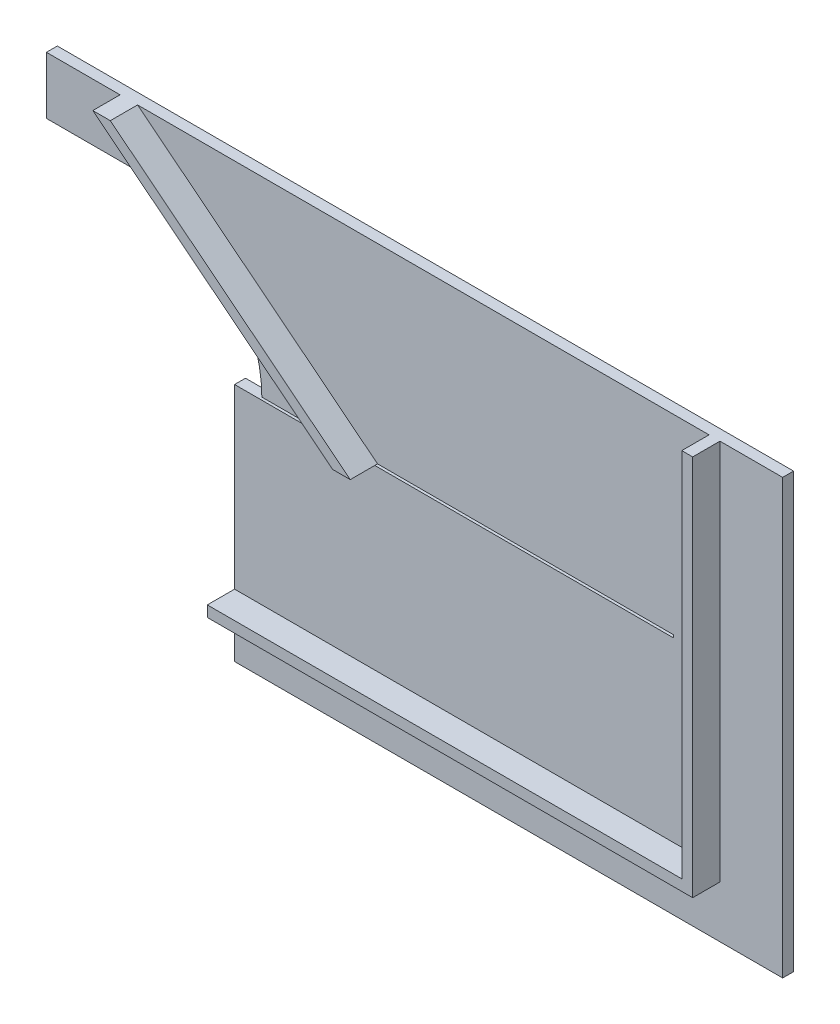
ISO-10303-21;
HEADER;
FILE_DESCRIPTION(('STEP AP214'),'2;1');
FILE_NAME('part.step','',(''),(''),'','','');
FILE_SCHEMA(('AUTOMOTIVE_DESIGN { 1 0 10303 214 1 1 1 1 }'));
ENDSEC;
DATA;
#1=APPLICATION_CONTEXT('core data for automotive mechanical design processes');
#2=APPLICATION_PROTOCOL_DEFINITION('international standard','automotive_design',2000,#1);
#3=PRODUCT_CONTEXT('',#1,'mechanical');
#4=PRODUCT('Part','Part','',(#3));
#5=PRODUCT_RELATED_PRODUCT_CATEGORY('part','',(#4));
#6=PRODUCT_DEFINITION_FORMATION('','',#4);
#7=PRODUCT_DEFINITION_CONTEXT('part definition',#1,'design');
#8=PRODUCT_DEFINITION('design','',#6,#7);
#9=PRODUCT_DEFINITION_SHAPE('','',#8);
#10=(LENGTH_UNIT() NAMED_UNIT(*) SI_UNIT(.MILLI.,.METRE.));
#11=(NAMED_UNIT(*) PLANE_ANGLE_UNIT() SI_UNIT($,.RADIAN.));
#12=(NAMED_UNIT(*) SI_UNIT($,.STERADIAN.) SOLID_ANGLE_UNIT());
#13=UNCERTAINTY_MEASURE_WITH_UNIT(LENGTH_MEASURE(1.E-05),#10,'distance_accuracy_value','');
#14=(GEOMETRIC_REPRESENTATION_CONTEXT(3) GLOBAL_UNCERTAINTY_ASSIGNED_CONTEXT((#13)) GLOBAL_UNIT_ASSIGNED_CONTEXT((#10,
#11,#12)) REPRESENTATION_CONTEXT('',''));
#15=CARTESIAN_POINT('',(0.,0.,0.));
#16=DIRECTION('',(0.,0.,1.));
#17=DIRECTION('',(1.,0.,0.));
#18=AXIS2_PLACEMENT_3D('',#15,#16,#17);
#19=CARTESIAN_POINT('',(0.,0.,0.));
#20=DIRECTION('',(0.,0.,1.));
#21=DIRECTION('',(1.,0.,0.));
#22=AXIS2_PLACEMENT_3D('',#19,#20,#21);
#23=PLANE('',#22);
#24=DIRECTION('',(1.,0.,0.));
#25=VECTOR('',#24,1.);
#26=CARTESIAN_POINT('',(0.,0.,0.));
#27=LINE('',#26,#25);
#28=CARTESIAN_POINT('',(33.4254595642836,0.,0.));
#29=VERTEX_POINT('',#28);
#30=CARTESIAN_POINT('',(243.,0.,0.));
#31=VERTEX_POINT('',#30);
#32=EDGE_CURVE('E291',#29,#31,#27,.T.);
#33=ORIENTED_EDGE('',*,*,#32,.F.);
#34=DIRECTION('',(-0.782601054175648,0.622523565821539,0.));
#35=VECTOR('',#34,1.);
#36=CARTESIAN_POINT('',(117.490094263286,-66.8695957832974,0.));
#37=LINE('',#36,#35);
#38=CARTESIAN_POINT('',(121.425459564284,-70.,0.));
#39=VERTEX_POINT('',#38);
#40=EDGE_CURVE('E336',#39,#29,#37,.T.);
#41=ORIENTED_EDGE('',*,*,#40,.F.);
#42=DIRECTION('',(-1.,0.,0.));
#43=VECTOR('',#42,1.);
#44=CARTESIAN_POINT('',(0.,-70.,0.));
#45=LINE('',#44,#43);
#46=CARTESIAN_POINT('',(230.,-70.,0.));
#47=VERTEX_POINT('',#46);
#48=EDGE_CURVE('E198',#47,#39,#45,.T.);
#49=ORIENTED_EDGE('',*,*,#48,.F.);
#50=DIRECTION('',(0.,1.,0.));
#51=VECTOR('',#50,1.);
#52=CARTESIAN_POINT('',(230.,0.,0.));
#53=LINE('',#52,#51);
#54=CARTESIAN_POINT('',(230.,-71.,0.));
#55=VERTEX_POINT('',#54);
#56=EDGE_CURVE('E275',#55,#47,#53,.T.);
#57=ORIENTED_EDGE('',*,*,#56,.F.);
#58=DIRECTION('',(1.,0.,0.));
#59=VECTOR('',#58,1.);
#60=CARTESIAN_POINT('',(0.,-71.,0.));
#61=LINE('',#60,#59);
#62=CARTESIAN_POINT('',(69.,-71.,0.));
#63=VERTEX_POINT('',#62);
#64=EDGE_CURVE('E277',#63,#55,#61,.T.);
#65=ORIENTED_EDGE('',*,*,#64,.F.);
#66=DIRECTION('',(0.,1.,0.));
#67=VECTOR('',#66,1.);
#68=CARTESIAN_POINT('',(69.,0.,0.));
#69=LINE('',#68,#67);
#70=CARTESIAN_POINT('',(69.,-136.,0.));
#71=VERTEX_POINT('',#70);
#72=EDGE_CURVE('E279',#71,#63,#69,.T.);
#73=ORIENTED_EDGE('',*,*,#72,.F.);
#74=DIRECTION('',(-1.,0.,0.));
#75=VECTOR('',#74,1.);
#76=CARTESIAN_POINT('',(243.,-136.,0.));
#77=LINE('',#76,#75);
#78=CARTESIAN_POINT('',(243.,-136.,0.));
#79=VERTEX_POINT('',#78);
#80=EDGE_CURVE('E202',#79,#71,#77,.T.);
#81=ORIENTED_EDGE('',*,*,#80,.F.);
#82=DIRECTION('',(0.,-1.,0.));
#83=VECTOR('',#82,1.);
#84=CARTESIAN_POINT('',(243.,0.,0.));
#85=LINE('',#84,#83);
#86=EDGE_CURVE('E199',#31,#79,#85,.T.);
#87=ORIENTED_EDGE('',*,*,#86,.F.);
#88=EDGE_LOOP('',(#33,#41,#49,#57,#65,#73,#81,#87));
#89=FACE_BOUND('',#88,.T.);
#90=ADVANCED_FACE('F35',(#89),#23,.T.);
#91=CARTESIAN_POINT('',(115.,-70.,0.));
#92=VERTEX_POINT('',#91);
#93=CARTESIAN_POINT('',(79.,-70.,0.));
#94=VERTEX_POINT('',#93);
#95=EDGE_CURVE('E273',#92,#94,#45,.T.);
#96=ORIENTED_EDGE('',*,*,#95,.F.);
#97=DIRECTION('',(0.782601054175648,-0.622523565821539,0.));
#98=VECTOR('',#97,1.);
#99=CARTESIAN_POINT('',(115.,-70.,0.));
#100=LINE('',#99,#98);
#101=CARTESIAN_POINT('',(27.,0.,0.));
#102=VERTEX_POINT('',#101);
#103=EDGE_CURVE('E192',#102,#92,#100,.T.);
#104=ORIENTED_EDGE('',*,*,#103,.F.);
#105=CARTESIAN_POINT('',(0.,0.,0.));
#106=VERTEX_POINT('',#105);
#107=EDGE_CURVE('E288',#106,#102,#27,.T.);
#108=ORIENTED_EDGE('',*,*,#107,.F.);
#109=DIRECTION('',(0.,-1.,0.));
#110=VECTOR('',#109,1.);
#111=CARTESIAN_POINT('',(0.,0.,0.));
#112=LINE('',#111,#110);
#113=CARTESIAN_POINT('',(0.,-21.,0.));
#114=VERTEX_POINT('',#113);
#115=EDGE_CURVE('E248',#106,#114,#112,.T.);
#116=ORIENTED_EDGE('',*,*,#115,.T.);
#117=DIRECTION('',(1.,0.,0.));
#118=VECTOR('',#117,1.);
#119=CARTESIAN_POINT('',(0.,-21.,0.));
#120=LINE('',#119,#118);
#121=CARTESIAN_POINT('',(30.,-21.,0.));
#122=VERTEX_POINT('',#121);
#123=EDGE_CURVE('E243',#114,#122,#120,.T.);
#124=ORIENTED_EDGE('',*,*,#123,.T.);
#125=CARTESIAN_POINT('',(30.,-70.,0.));
#126=DIRECTION('',(0.,0.,1.));
#127=DIRECTION('',(1.,0.,0.));
#128=AXIS2_PLACEMENT_3D('',#125,#126,#127);
#129=CIRCLE('',#128,49.);
#130=EDGE_CURVE('E270',#122,#94,#129,.F.);
#131=ORIENTED_EDGE('',*,*,#130,.T.);
#132=EDGE_LOOP('',(#96,#104,#108,#116,#124,#131));
#133=FACE_BOUND('',#132,.T.);
#134=ADVANCED_FACE('F323',(#133),#23,.T.);
#135=DIRECTION('',(0.,1.,0.));
#136=VECTOR('',#135,1.);
#137=CARTESIAN_POINT('',(247.,0.,0.));
#138=LINE('',#137,#136);
#139=CARTESIAN_POINT('',(247.,-140.,0.));
#140=VERTEX_POINT('',#139);
#141=CARTESIAN_POINT('',(247.,0.,0.));
#142=VERTEX_POINT('',#141);
#143=EDGE_CURVE('E60',#140,#142,#138,.T.);
#144=ORIENTED_EDGE('',*,*,#143,.F.);
#145=DIRECTION('',(1.,0.,0.));
#146=VECTOR('',#145,1.);
#147=CARTESIAN_POINT('',(247.,-140.,0.));
#148=LINE('',#147,#146);
#149=CARTESIAN_POINT('',(69.,-140.,0.));
#150=VERTEX_POINT('',#149);
#151=EDGE_CURVE('E223',#150,#140,#148,.T.);
#152=ORIENTED_EDGE('',*,*,#151,.F.);
#153=CARTESIAN_POINT('',(69.,-159.,0.));
#154=VERTEX_POINT('',#153);
#155=EDGE_CURVE('E280',#154,#150,#69,.T.);
#156=ORIENTED_EDGE('',*,*,#155,.F.);
#157=DIRECTION('',(-1.,0.,0.));
#158=VECTOR('',#157,1.);
#159=CARTESIAN_POINT('',(0.,-159.,0.));
#160=LINE('',#159,#158);
#161=CARTESIAN_POINT('',(270.,-159.,0.));
#162=VERTEX_POINT('',#161);
#163=EDGE_CURVE('E283',#162,#154,#160,.T.);
#164=ORIENTED_EDGE('',*,*,#163,.F.);
#165=DIRECTION('',(0.,-1.,0.));
#166=VECTOR('',#165,1.);
#167=CARTESIAN_POINT('',(270.,0.,0.));
#168=LINE('',#167,#166);
#169=CARTESIAN_POINT('',(270.,0.,0.));
#170=VERTEX_POINT('',#169);
#171=EDGE_CURVE('E285',#170,#162,#168,.T.);
#172=ORIENTED_EDGE('',*,*,#171,.F.);
#173=EDGE_CURVE('E287',#142,#170,#27,.T.);
#174=ORIENTED_EDGE('',*,*,#173,.F.);
#175=EDGE_LOOP('',(#144,#152,#156,#164,#172,#174));
#176=FACE_BOUND('',#175,.T.);
#177=ADVANCED_FACE('F388',(#176),#23,.T.);
#178=CARTESIAN_POINT('',(0.,-21.,-4.));
#179=DIRECTION('',(0.,-1.,0.));
#180=DIRECTION('',(1.,0.,0.));
#181=AXIS2_PLACEMENT_3D('',#178,#179,#180);
#182=PLANE('',#181);
#183=ORIENTED_EDGE('',*,*,#123,.F.);
#184=DIRECTION('',(0.,0.,1.));
#185=VECTOR('',#184,1.);
#186=CARTESIAN_POINT('',(0.,-21.,-4.));
#187=LINE('',#186,#185);
#188=CARTESIAN_POINT('',(0.,-21.,-4.));
#189=VERTEX_POINT('',#188);
#190=EDGE_CURVE('E11',#189,#114,#187,.T.);
#191=ORIENTED_EDGE('',*,*,#190,.F.);
#192=DIRECTION('',(1.,0.,0.));
#193=VECTOR('',#192,1.);
#194=CARTESIAN_POINT('',(0.,-21.,-4.));
#195=LINE('',#194,#193);
#196=CARTESIAN_POINT('',(30.,-21.,-4.));
#197=VERTEX_POINT('',#196);
#198=EDGE_CURVE('E244',#189,#197,#195,.T.);
#199=ORIENTED_EDGE('',*,*,#198,.T.);
#200=DIRECTION('',(0.,0.,1.));
#201=VECTOR('',#200,1.);
#202=CARTESIAN_POINT('',(30.,-21.,-4.));
#203=LINE('',#202,#201);
#204=EDGE_CURVE('E39',#197,#122,#203,.T.);
#205=ORIENTED_EDGE('',*,*,#204,.T.);
#206=EDGE_LOOP('',(#183,#191,#199,#205));
#207=FACE_BOUND('',#206,.T.);
#208=ADVANCED_FACE('F37',(#207),#182,.T.);
#209=CARTESIAN_POINT('',(0.,0.,-4.));
#210=DIRECTION('',(-1.,0.,0.));
#211=DIRECTION('',(0.,-1.,0.));
#212=AXIS2_PLACEMENT_3D('',#209,#210,#211);
#213=PLANE('',#212);
#214=ORIENTED_EDGE('',*,*,#115,.F.);
#215=DIRECTION('',(0.,0.,1.));
#216=VECTOR('',#215,1.);
#217=CARTESIAN_POINT('',(0.,0.,-4.));
#218=LINE('',#217,#216);
#219=CARTESIAN_POINT('',(0.,0.,-4.));
#220=VERTEX_POINT('',#219);
#221=EDGE_CURVE('E44',#220,#106,#218,.T.);
#222=ORIENTED_EDGE('',*,*,#221,.F.);
#223=DIRECTION('',(0.,-1.,0.));
#224=VECTOR('',#223,1.);
#225=CARTESIAN_POINT('',(0.,0.,-4.));
#226=LINE('',#225,#224);
#227=EDGE_CURVE('E265',#220,#189,#226,.T.);
#228=ORIENTED_EDGE('',*,*,#227,.T.);
#229=ORIENTED_EDGE('',*,*,#190,.T.);
#230=EDGE_LOOP('',(#214,#222,#228,#229));
#231=FACE_BOUND('',#230,.T.);
#232=ADVANCED_FACE('F327',(#231),#213,.T.);
#233=CARTESIAN_POINT('',(0.,0.,-4.));
#234=DIRECTION('',(0.,-1.,0.));
#235=DIRECTION('',(0.,0.,-1.));
#236=AXIS2_PLACEMENT_3D('',#233,#234,#235);
#237=PLANE('',#236);
#238=ORIENTED_EDGE('',*,*,#107,.T.);
#239=DIRECTION('',(0.,0.,-1.));
#240=VECTOR('',#239,1.);
#241=CARTESIAN_POINT('',(27.,0.,10.));
#242=LINE('',#241,#240);
#243=CARTESIAN_POINT('',(27.,0.,10.));
#244=VERTEX_POINT('',#243);
#245=EDGE_CURVE('E52',#244,#102,#242,.T.);
#246=ORIENTED_EDGE('',*,*,#245,.F.);
#247=DIRECTION('',(-1.,0.,0.));
#248=VECTOR('',#247,1.);
#249=CARTESIAN_POINT('',(27.,0.,10.));
#250=LINE('',#249,#248);
#251=CARTESIAN_POINT('',(33.4254595642836,0.,10.));
#252=VERTEX_POINT('',#251);
#253=EDGE_CURVE('E183',#252,#244,#250,.T.);
#254=ORIENTED_EDGE('',*,*,#253,.F.);
#255=DIRECTION('',(0.,0.,-1.));
#256=VECTOR('',#255,1.);
#257=CARTESIAN_POINT('',(33.4254595642836,0.,10.));
#258=LINE('',#257,#256);
#259=EDGE_CURVE('E180',#252,#29,#258,.T.);
#260=ORIENTED_EDGE('',*,*,#259,.T.);
#261=ORIENTED_EDGE('',*,*,#32,.T.);
#262=DIRECTION('',(0.,0.,-1.));
#263=VECTOR('',#262,1.);
#264=CARTESIAN_POINT('',(243.,0.,10.));
#265=LINE('',#264,#263);
#266=CARTESIAN_POINT('',(243.,0.,10.));
#267=VERTEX_POINT('',#266);
#268=EDGE_CURVE('E240',#267,#31,#265,.T.);
#269=ORIENTED_EDGE('',*,*,#268,.F.);
#270=DIRECTION('',(-1.,0.,0.));
#271=VECTOR('',#270,1.);
#272=CARTESIAN_POINT('',(243.,0.,10.));
#273=LINE('',#272,#271);
#274=CARTESIAN_POINT('',(247.,0.,10.));
#275=VERTEX_POINT('',#274);
#276=EDGE_CURVE('E207',#275,#267,#273,.T.);
#277=ORIENTED_EDGE('',*,*,#276,.F.);
#278=DIRECTION('',(0.,0.,-1.));
#279=VECTOR('',#278,1.);
#280=CARTESIAN_POINT('',(247.,0.,10.));
#281=LINE('',#280,#279);
#282=EDGE_CURVE('E219',#275,#142,#281,.T.);
#283=ORIENTED_EDGE('',*,*,#282,.T.);
#284=ORIENTED_EDGE('',*,*,#173,.T.);
#285=DIRECTION('',(0.,0.,1.));
#286=VECTOR('',#285,1.);
#287=CARTESIAN_POINT('',(270.,0.,-4.));
#288=LINE('',#287,#286);
#289=CARTESIAN_POINT('',(270.,0.,-4.));
#290=VERTEX_POINT('',#289);
#291=EDGE_CURVE('E295',#290,#170,#288,.T.);
#292=ORIENTED_EDGE('',*,*,#291,.F.);
#293=DIRECTION('',(1.,0.,0.));
#294=VECTOR('',#293,1.);
#295=CARTESIAN_POINT('',(0.,0.,-4.));
#296=LINE('',#295,#294);
#297=EDGE_CURVE('E263',#220,#290,#296,.T.);
#298=ORIENTED_EDGE('',*,*,#297,.F.);
#299=ORIENTED_EDGE('',*,*,#221,.T.);
#300=EDGE_LOOP('',(#238,#246,#254,#260,#261,#269,#277,#283,#284,#292,#298,#299));
#301=FACE_BOUND('',#300,.T.);
#302=ADVANCED_FACE('F339',(#301),#237,.F.);
#303=CARTESIAN_POINT('',(270.,0.,-4.));
#304=DIRECTION('',(-1.,0.,0.));
#305=DIRECTION('',(0.,0.,1.));
#306=AXIS2_PLACEMENT_3D('',#303,#304,#305);
#307=PLANE('',#306);
#308=ORIENTED_EDGE('',*,*,#171,.T.);
#309=DIRECTION('',(0.,0.,1.));
#310=VECTOR('',#309,1.);
#311=CARTESIAN_POINT('',(270.,-159.,-4.));
#312=LINE('',#311,#310);
#313=CARTESIAN_POINT('',(270.,-159.,-4.));
#314=VERTEX_POINT('',#313);
#315=EDGE_CURVE('E298',#314,#162,#312,.T.);
#316=ORIENTED_EDGE('',*,*,#315,.F.);
#317=DIRECTION('',(0.,-1.,0.));
#318=VECTOR('',#317,1.);
#319=CARTESIAN_POINT('',(270.,0.,-4.));
#320=LINE('',#319,#318);
#321=EDGE_CURVE('E261',#290,#314,#320,.T.);
#322=ORIENTED_EDGE('',*,*,#321,.F.);
#323=ORIENTED_EDGE('',*,*,#291,.T.);
#324=EDGE_LOOP('',(#308,#316,#322,#323));
#325=FACE_BOUND('',#324,.T.);
#326=ADVANCED_FACE('F346',(#325),#307,.F.);
#327=CARTESIAN_POINT('',(0.,-159.,-4.));
#328=DIRECTION('',(0.,1.,0.));
#329=DIRECTION('',(-1.,0.,0.));
#330=AXIS2_PLACEMENT_3D('',#327,#328,#329);
#331=PLANE('',#330);
#332=ORIENTED_EDGE('',*,*,#163,.T.);
#333=DIRECTION('',(0.,0.,1.));
#334=VECTOR('',#333,1.);
#335=CARTESIAN_POINT('',(69.,-159.,-4.));
#336=LINE('',#335,#334);
#337=CARTESIAN_POINT('',(69.,-159.,-4.));
#338=VERTEX_POINT('',#337);
#339=EDGE_CURVE('E301',#338,#154,#336,.T.);
#340=ORIENTED_EDGE('',*,*,#339,.F.);
#341=DIRECTION('',(-1.,0.,0.));
#342=VECTOR('',#341,1.);
#343=CARTESIAN_POINT('',(0.,-159.,-4.));
#344=LINE('',#343,#342);
#345=EDGE_CURVE('E259',#314,#338,#344,.T.);
#346=ORIENTED_EDGE('',*,*,#345,.F.);
#347=ORIENTED_EDGE('',*,*,#315,.T.);
#348=EDGE_LOOP('',(#332,#340,#346,#347));
#349=FACE_BOUND('',#348,.T.);
#350=ADVANCED_FACE('F350',(#349),#331,.F.);
#351=CARTESIAN_POINT('',(69.,0.,-4.));
#352=DIRECTION('',(1.,0.,0.));
#353=DIRECTION('',(0.,0.,-1.));
#354=AXIS2_PLACEMENT_3D('',#351,#352,#353);
#355=PLANE('',#354);
#356=ORIENTED_EDGE('',*,*,#155,.T.);
#357=DIRECTION('',(0.,0.,-1.));
#358=VECTOR('',#357,1.);
#359=CARTESIAN_POINT('',(69.,-140.,10.));
#360=LINE('',#359,#358);
#361=CARTESIAN_POINT('',(69.,-140.,10.));
#362=VERTEX_POINT('',#361);
#363=EDGE_CURVE('E231',#362,#150,#360,.T.);
#364=ORIENTED_EDGE('',*,*,#363,.F.);
#365=DIRECTION('',(0.,-1.,0.));
#366=VECTOR('',#365,1.);
#367=CARTESIAN_POINT('',(69.,-136.,10.));
#368=LINE('',#367,#366);
#369=CARTESIAN_POINT('',(69.,-136.,10.));
#370=VERTEX_POINT('',#369);
#371=EDGE_CURVE('E214',#370,#362,#368,.T.);
#372=ORIENTED_EDGE('',*,*,#371,.F.);
#373=DIRECTION('',(0.,0.,-1.));
#374=VECTOR('',#373,1.);
#375=CARTESIAN_POINT('',(69.,-136.,10.));
#376=LINE('',#375,#374);
#377=EDGE_CURVE('E234',#370,#71,#376,.T.);
#378=ORIENTED_EDGE('',*,*,#377,.T.);
#379=ORIENTED_EDGE('',*,*,#72,.T.);
#380=DIRECTION('',(0.,0.,1.));
#381=VECTOR('',#380,1.);
#382=CARTESIAN_POINT('',(69.,-71.,-4.));
#383=LINE('',#382,#381);
#384=CARTESIAN_POINT('',(69.,-71.,-4.));
#385=VERTEX_POINT('',#384);
#386=EDGE_CURVE('E304',#385,#63,#383,.T.);
#387=ORIENTED_EDGE('',*,*,#386,.F.);
#388=DIRECTION('',(0.,1.,0.));
#389=VECTOR('',#388,1.);
#390=CARTESIAN_POINT('',(69.,0.,-4.));
#391=LINE('',#390,#389);
#392=EDGE_CURVE('E257',#338,#385,#391,.T.);
#393=ORIENTED_EDGE('',*,*,#392,.F.);
#394=ORIENTED_EDGE('',*,*,#339,.T.);
#395=EDGE_LOOP('',(#356,#364,#372,#378,#379,#387,#393,#394));
#396=FACE_BOUND('',#395,.T.);
#397=ADVANCED_FACE('F355',(#396),#355,.F.);
#398=CARTESIAN_POINT('',(0.,-71.,-4.));
#399=DIRECTION('',(0.,-1.,0.));
#400=DIRECTION('',(0.,0.,-1.));
#401=AXIS2_PLACEMENT_3D('',#398,#399,#400);
#402=PLANE('',#401);
#403=ORIENTED_EDGE('',*,*,#64,.T.);
#404=DIRECTION('',(0.,0.,1.));
#405=VECTOR('',#404,1.);
#406=CARTESIAN_POINT('',(230.,-71.,-4.));
#407=LINE('',#406,#405);
#408=CARTESIAN_POINT('',(230.,-71.,-4.));
#409=VERTEX_POINT('',#408);
#410=EDGE_CURVE('E307',#409,#55,#407,.T.);
#411=ORIENTED_EDGE('',*,*,#410,.F.);
#412=DIRECTION('',(1.,0.,0.));
#413=VECTOR('',#412,1.);
#414=CARTESIAN_POINT('',(0.,-71.,-4.));
#415=LINE('',#414,#413);
#416=EDGE_CURVE('E255',#385,#409,#415,.T.);
#417=ORIENTED_EDGE('',*,*,#416,.F.);
#418=ORIENTED_EDGE('',*,*,#386,.T.);
#419=EDGE_LOOP('',(#403,#411,#417,#418));
#420=FACE_BOUND('',#419,.T.);
#421=ADVANCED_FACE('F359',(#420),#402,.F.);
#422=CARTESIAN_POINT('',(230.,0.,-4.));
#423=DIRECTION('',(1.,0.,0.));
#424=DIRECTION('',(0.,0.,-1.));
#425=AXIS2_PLACEMENT_3D('',#422,#423,#424);
#426=PLANE('',#425);
#427=ORIENTED_EDGE('',*,*,#56,.T.);
#428=DIRECTION('',(0.,0.,1.));
#429=VECTOR('',#428,1.);
#430=CARTESIAN_POINT('',(230.,-70.,-4.));
#431=LINE('',#430,#429);
#432=CARTESIAN_POINT('',(230.,-70.,-4.));
#433=VERTEX_POINT('',#432);
#434=EDGE_CURVE('E310',#433,#47,#431,.T.);
#435=ORIENTED_EDGE('',*,*,#434,.F.);
#436=DIRECTION('',(0.,1.,0.));
#437=VECTOR('',#436,1.);
#438=CARTESIAN_POINT('',(230.,0.,-4.));
#439=LINE('',#438,#437);
#440=EDGE_CURVE('E253',#409,#433,#439,.T.);
#441=ORIENTED_EDGE('',*,*,#440,.F.);
#442=ORIENTED_EDGE('',*,*,#410,.T.);
#443=EDGE_LOOP('',(#427,#435,#441,#442));
#444=FACE_BOUND('',#443,.T.);
#445=ADVANCED_FACE('F363',(#444),#426,.F.);
#446=CARTESIAN_POINT('',(0.,-70.,-4.));
#447=DIRECTION('',(0.,1.,0.));
#448=DIRECTION('',(-1.,0.,0.));
#449=AXIS2_PLACEMENT_3D('',#446,#447,#448);
#450=PLANE('',#449);
#451=ORIENTED_EDGE('',*,*,#48,.T.);
#452=DIRECTION('',(0.,0.,-1.));
#453=VECTOR('',#452,1.);
#454=CARTESIAN_POINT('',(121.425459564284,-70.,10.));
#455=LINE('',#454,#453);
#456=CARTESIAN_POINT('',(121.425459564284,-70.,10.));
#457=VERTEX_POINT('',#456);
#458=EDGE_CURVE('E177',#457,#39,#455,.T.);
#459=ORIENTED_EDGE('',*,*,#458,.F.);
#460=DIRECTION('',(1.,0.,0.));
#461=VECTOR('',#460,1.);
#462=CARTESIAN_POINT('',(121.425459564284,-70.,10.));
#463=LINE('',#462,#461);
#464=CARTESIAN_POINT('',(115.,-70.,10.));
#465=VERTEX_POINT('',#464);
#466=EDGE_CURVE('E184',#465,#457,#463,.T.);
#467=ORIENTED_EDGE('',*,*,#466,.F.);
#468=DIRECTION('',(0.,0.,-1.));
#469=VECTOR('',#468,1.);
#470=CARTESIAN_POINT('',(115.,-70.,10.));
#471=LINE('',#470,#469);
#472=EDGE_CURVE('E335',#465,#92,#471,.T.);
#473=ORIENTED_EDGE('',*,*,#472,.T.);
#474=ORIENTED_EDGE('',*,*,#95,.T.);
#475=DIRECTION('',(0.,0.,1.));
#476=VECTOR('',#475,1.);
#477=CARTESIAN_POINT('',(79.,-70.,-4.));
#478=LINE('',#477,#476);
#479=CARTESIAN_POINT('',(79.,-70.,-4.));
#480=VERTEX_POINT('',#479);
#481=EDGE_CURVE('E311',#480,#94,#478,.T.);
#482=ORIENTED_EDGE('',*,*,#481,.F.);
#483=DIRECTION('',(-1.,0.,0.));
#484=VECTOR('',#483,1.);
#485=CARTESIAN_POINT('',(0.,-70.,-4.));
#486=LINE('',#485,#484);
#487=EDGE_CURVE('E251',#433,#480,#486,.T.);
#488=ORIENTED_EDGE('',*,*,#487,.F.);
#489=ORIENTED_EDGE('',*,*,#434,.T.);
#490=EDGE_LOOP('',(#451,#459,#467,#473,#474,#482,#488,#489));
#491=FACE_BOUND('',#490,.T.);
#492=ADVANCED_FACE('F195',(#491),#450,.F.);
#493=CARTESIAN_POINT('',(30.,-70.,-4.));
#494=DIRECTION('',(0.,0.,1.));
#495=DIRECTION('',(1.,0.,0.));
#496=AXIS2_PLACEMENT_3D('',#493,#494,#495);
#497=CYLINDRICAL_SURFACE('',#496,49.);
#498=ORIENTED_EDGE('',*,*,#130,.F.);
#499=ORIENTED_EDGE('',*,*,#204,.F.);
#500=CARTESIAN_POINT('',(30.,-70.,-4.));
#501=DIRECTION('',(0.,0.,1.));
#502=DIRECTION('',(1.,0.,0.));
#503=AXIS2_PLACEMENT_3D('',#500,#501,#502);
#504=CIRCLE('',#503,49.);
#505=EDGE_CURVE('E247',#197,#480,#504,.F.);
#506=ORIENTED_EDGE('',*,*,#505,.T.);
#507=ORIENTED_EDGE('',*,*,#481,.T.);
#508=EDGE_LOOP('',(#498,#499,#506,#507));
#509=FACE_BOUND('',#508,.T.);
#510=ADVANCED_FACE('F320',(#509),#497,.F.);
#511=CARTESIAN_POINT('',(0.,0.,-4.));
#512=DIRECTION('',(0.,0.,1.));
#513=DIRECTION('',(1.,0.,0.));
#514=AXIS2_PLACEMENT_3D('',#511,#512,#513);
#515=PLANE('',#514);
#516=ORIENTED_EDGE('',*,*,#198,.F.);
#517=ORIENTED_EDGE('',*,*,#227,.F.);
#518=ORIENTED_EDGE('',*,*,#297,.T.);
#519=ORIENTED_EDGE('',*,*,#321,.T.);
#520=ORIENTED_EDGE('',*,*,#345,.T.);
#521=ORIENTED_EDGE('',*,*,#392,.T.);
#522=ORIENTED_EDGE('',*,*,#416,.T.);
#523=ORIENTED_EDGE('',*,*,#440,.T.);
#524=ORIENTED_EDGE('',*,*,#487,.T.);
#525=ORIENTED_EDGE('',*,*,#505,.F.);
#526=EDGE_LOOP('',(#516,#517,#518,#519,#520,#521,#522,#523,#524,#525));
#527=FACE_BOUND('',#526,.T.);
#528=ADVANCED_FACE('F331',(#527),#515,.F.);
#529=CARTESIAN_POINT('',(243.,0.,10.));
#530=DIRECTION('',(1.,0.,0.));
#531=DIRECTION('',(0.,0.,-1.));
#532=AXIS2_PLACEMENT_3D('',#529,#530,#531);
#533=PLANE('',#532);
#534=ORIENTED_EDGE('',*,*,#86,.T.);
#535=DIRECTION('',(0.,0.,-1.));
#536=VECTOR('',#535,1.);
#537=CARTESIAN_POINT('',(243.,-136.,10.));
#538=LINE('',#537,#536);
#539=CARTESIAN_POINT('',(243.,-136.,10.));
#540=VERTEX_POINT('',#539);
#541=EDGE_CURVE('E237',#540,#79,#538,.T.);
#542=ORIENTED_EDGE('',*,*,#541,.F.);
#543=DIRECTION('',(0.,-1.,0.));
#544=VECTOR('',#543,1.);
#545=CARTESIAN_POINT('',(243.,0.,10.));
#546=LINE('',#545,#544);
#547=EDGE_CURVE('E210',#267,#540,#546,.T.);
#548=ORIENTED_EDGE('',*,*,#547,.F.);
#549=ORIENTED_EDGE('',*,*,#268,.T.);
#550=EDGE_LOOP('',(#534,#542,#548,#549));
#551=FACE_BOUND('',#550,.T.);
#552=ADVANCED_FACE('F375',(#551),#533,.F.);
#553=CARTESIAN_POINT('',(243.,-136.,10.));
#554=DIRECTION('',(0.,-1.,0.));
#555=DIRECTION('',(0.,0.,-1.));
#556=AXIS2_PLACEMENT_3D('',#553,#554,#555);
#557=PLANE('',#556);
#558=ORIENTED_EDGE('',*,*,#80,.T.);
#559=ORIENTED_EDGE('',*,*,#377,.F.);
#560=DIRECTION('',(-1.,0.,0.));
#561=VECTOR('',#560,1.);
#562=CARTESIAN_POINT('',(243.,-136.,10.));
#563=LINE('',#562,#561);
#564=EDGE_CURVE('E212',#540,#370,#563,.T.);
#565=ORIENTED_EDGE('',*,*,#564,.F.);
#566=ORIENTED_EDGE('',*,*,#541,.T.);
#567=EDGE_LOOP('',(#558,#559,#565,#566));
#568=FACE_BOUND('',#567,.T.);
#569=ADVANCED_FACE('F392',(#568),#557,.F.);
#570=CARTESIAN_POINT('',(247.,-140.,10.));
#571=DIRECTION('',(0.,1.,0.));
#572=DIRECTION('',(-1.,0.,0.));
#573=AXIS2_PLACEMENT_3D('',#570,#571,#572);
#574=PLANE('',#573);
#575=ORIENTED_EDGE('',*,*,#151,.T.);
#576=DIRECTION('',(0.,0.,-1.));
#577=VECTOR('',#576,1.);
#578=CARTESIAN_POINT('',(247.,-140.,10.));
#579=LINE('',#578,#577);
#580=CARTESIAN_POINT('',(247.,-140.,10.));
#581=VERTEX_POINT('',#580);
#582=EDGE_CURVE('E228',#581,#140,#579,.T.);
#583=ORIENTED_EDGE('',*,*,#582,.F.);
#584=DIRECTION('',(1.,0.,0.));
#585=VECTOR('',#584,1.);
#586=CARTESIAN_POINT('',(247.,-140.,10.));
#587=LINE('',#586,#585);
#588=EDGE_CURVE('E216',#362,#581,#587,.T.);
#589=ORIENTED_EDGE('',*,*,#588,.F.);
#590=ORIENTED_EDGE('',*,*,#363,.T.);
#591=EDGE_LOOP('',(#575,#583,#589,#590));
#592=FACE_BOUND('',#591,.T.);
#593=ADVANCED_FACE('F386',(#592),#574,.F.);
#594=CARTESIAN_POINT('',(247.,0.,10.));
#595=DIRECTION('',(-1.,0.,0.));
#596=DIRECTION('',(0.,-1.,0.));
#597=AXIS2_PLACEMENT_3D('',#594,#595,#596);
#598=PLANE('',#597);
#599=ORIENTED_EDGE('',*,*,#143,.T.);
#600=ORIENTED_EDGE('',*,*,#282,.F.);
#601=DIRECTION('',(0.,1.,0.));
#602=VECTOR('',#601,1.);
#603=CARTESIAN_POINT('',(247.,0.,10.));
#604=LINE('',#603,#602);
#605=EDGE_CURVE('E218',#581,#275,#604,.T.);
#606=ORIENTED_EDGE('',*,*,#605,.F.);
#607=ORIENTED_EDGE('',*,*,#582,.T.);
#608=EDGE_LOOP('',(#599,#600,#606,#607));
#609=FACE_BOUND('',#608,.T.);
#610=ADVANCED_FACE('F382',(#609),#598,.F.);
#611=CARTESIAN_POINT('',(0.,0.,10.));
#612=DIRECTION('',(0.,0.,-1.));
#613=DIRECTION('',(-1.,0.,0.));
#614=AXIS2_PLACEMENT_3D('',#611,#612,#613);
#615=PLANE('',#614);
#616=ORIENTED_EDGE('',*,*,#276,.T.);
#617=ORIENTED_EDGE('',*,*,#547,.T.);
#618=ORIENTED_EDGE('',*,*,#564,.T.);
#619=ORIENTED_EDGE('',*,*,#371,.T.);
#620=ORIENTED_EDGE('',*,*,#588,.T.);
#621=ORIENTED_EDGE('',*,*,#605,.T.);
#622=EDGE_LOOP('',(#616,#617,#618,#619,#620,#621));
#623=FACE_BOUND('',#622,.T.);
#624=ADVANCED_FACE('F378',(#623),#615,.F.);
#625=CARTESIAN_POINT('',(117.490094263286,-66.8695957832974,10.));
#626=DIRECTION('',(-0.622523565821539,-0.782601054175649,0.));
#627=DIRECTION('',(0.782601054175649,-0.622523565821539,0.));
#628=AXIS2_PLACEMENT_3D('',#625,#626,#627);
#629=PLANE('',#628);
#630=ORIENTED_EDGE('',*,*,#40,.T.);
#631=ORIENTED_EDGE('',*,*,#259,.F.);
#632=DIRECTION('',(-0.782601054175649,0.622523565821538,0.));
#633=VECTOR('',#632,1.);
#634=CARTESIAN_POINT('',(117.490094263286,-66.8695957832974,10.));
#635=LINE('',#634,#633);
#636=EDGE_CURVE('E173',#457,#252,#635,.T.);
#637=ORIENTED_EDGE('',*,*,#636,.F.);
#638=ORIENTED_EDGE('',*,*,#458,.T.);
#639=EDGE_LOOP('',(#630,#631,#637,#638));
#640=FACE_BOUND('',#639,.T.);
#641=ADVANCED_FACE('F175',(#640),#629,.F.);
#642=CARTESIAN_POINT('',(115.,-70.,10.));
#643=DIRECTION('',(0.622523565821539,0.782601054175649,0.));
#644=DIRECTION('',(-0.782601054175649,0.622523565821539,0.));
#645=AXIS2_PLACEMENT_3D('',#642,#643,#644);
#646=PLANE('',#645);
#647=ORIENTED_EDGE('',*,*,#103,.T.);
#648=ORIENTED_EDGE('',*,*,#472,.F.);
#649=DIRECTION('',(0.782601054175648,-0.622523565821539,0.));
#650=VECTOR('',#649,1.);
#651=CARTESIAN_POINT('',(115.,-70.,10.));
#652=LINE('',#651,#650);
#653=EDGE_CURVE('E188',#244,#465,#652,.T.);
#654=ORIENTED_EDGE('',*,*,#653,.F.);
#655=ORIENTED_EDGE('',*,*,#245,.T.);
#656=EDGE_LOOP('',(#647,#648,#654,#655));
#657=FACE_BOUND('',#656,.T.);
#658=ADVANCED_FACE('F505',(#657),#646,.F.);
#659=CARTESIAN_POINT('',(0.,0.,10.));
#660=DIRECTION('',(0.,0.,-1.));
#661=DIRECTION('',(-1.,0.,0.));
#662=AXIS2_PLACEMENT_3D('',#659,#660,#661);
#663=PLANE('',#662);
#664=ORIENTED_EDGE('',*,*,#466,.T.);
#665=ORIENTED_EDGE('',*,*,#636,.T.);
#666=ORIENTED_EDGE('',*,*,#253,.T.);
#667=ORIENTED_EDGE('',*,*,#653,.T.);
#668=EDGE_LOOP('',(#664,#665,#666,#667));
#669=FACE_BOUND('',#668,.T.);
#670=ADVANCED_FACE('F187',(#669),#663,.F.);
#671=CLOSED_SHELL('',(#90,#134,#177,#208,#232,#302,#326,#350,#397,#421,#445,#492,#510,#528,#552,
#569,#593,#610,#624,#641,#658,#670));
#672=MANIFOLD_SOLID_BREP('B2',#671);
#673=ADVANCED_BREP_SHAPE_REPRESENTATION('',(#18,#672),#14);
#674=SHAPE_DEFINITION_REPRESENTATION(#9,#673);
ENDSEC;
END-ISO-10303-21;
